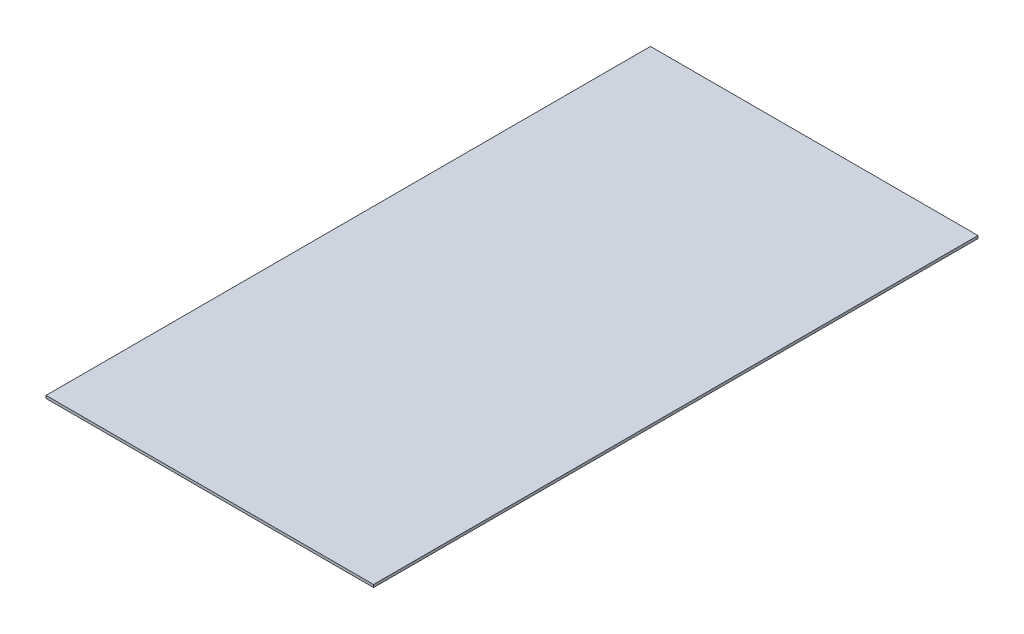
ISO-10303-21;
HEADER;
FILE_DESCRIPTION(('STEP AP214'),'2;1');
FILE_NAME('part.step','',(''),(''),'','','');
FILE_SCHEMA(('AUTOMOTIVE_DESIGN { 1 0 10303 214 1 1 1 1 }'));
ENDSEC;
DATA;
#1=APPLICATION_CONTEXT('core data for automotive mechanical design processes');
#2=APPLICATION_PROTOCOL_DEFINITION('international standard','automotive_design',2000,#1);
#3=PRODUCT_CONTEXT('',#1,'mechanical');
#4=PRODUCT('Part','Part','',(#3));
#5=PRODUCT_RELATED_PRODUCT_CATEGORY('part','',(#4));
#6=PRODUCT_DEFINITION_FORMATION('','',#4);
#7=PRODUCT_DEFINITION_CONTEXT('part definition',#1,'design');
#8=PRODUCT_DEFINITION('design','',#6,#7);
#9=PRODUCT_DEFINITION_SHAPE('','',#8);
#10=(LENGTH_UNIT() NAMED_UNIT(*) SI_UNIT(.MILLI.,.METRE.));
#11=(NAMED_UNIT(*) PLANE_ANGLE_UNIT() SI_UNIT($,.RADIAN.));
#12=(NAMED_UNIT(*) SI_UNIT($,.STERADIAN.) SOLID_ANGLE_UNIT());
#13=UNCERTAINTY_MEASURE_WITH_UNIT(LENGTH_MEASURE(1.E-05),#10,'distance_accuracy_value','');
#14=(GEOMETRIC_REPRESENTATION_CONTEXT(3) GLOBAL_UNCERTAINTY_ASSIGNED_CONTEXT((#13)) GLOBAL_UNIT_ASSIGNED_CONTEXT((#10,
#11,#12)) REPRESENTATION_CONTEXT('',''));
#15=CARTESIAN_POINT('',(0.,0.,0.));
#16=DIRECTION('',(0.,0.,1.));
#17=DIRECTION('',(1.,0.,0.));
#18=AXIS2_PLACEMENT_3D('',#15,#16,#17);
#19=CARTESIAN_POINT('',(0.,0.18,0.));
#20=DIRECTION('',(1.,0.,0.));
#21=DIRECTION('',(0.,0.,-1.));
#22=AXIS2_PLACEMENT_3D('',#19,#20,#21);
#23=PLANE('',#22);
#24=DIRECTION('',(0.,0.,1.));
#25=VECTOR('',#24,1.);
#26=CARTESIAN_POINT('',(0.,0.,0.));
#27=LINE('',#26,#25);
#28=CARTESIAN_POINT('',(0.,0.,-40.6));
#29=VERTEX_POINT('',#28);
#30=CARTESIAN_POINT('',(0.,0.,0.));
#31=VERTEX_POINT('',#30);
#32=EDGE_CURVE('E95',#29,#31,#27,.T.);
#33=ORIENTED_EDGE('',*,*,#32,.T.);
#34=DIRECTION('',(0.,-1.,0.));
#35=VECTOR('',#34,1.);
#36=CARTESIAN_POINT('',(0.,0.18,0.));
#37=LINE('',#36,#35);
#38=CARTESIAN_POINT('',(0.,0.18,0.));
#39=VERTEX_POINT('',#38);
#40=EDGE_CURVE('E11',#39,#31,#37,.T.);
#41=ORIENTED_EDGE('',*,*,#40,.F.);
#42=DIRECTION('',(0.,0.,1.));
#43=VECTOR('',#42,1.);
#44=CARTESIAN_POINT('',(0.,0.18,0.));
#45=LINE('',#44,#43);
#46=CARTESIAN_POINT('',(0.,0.18,-40.6));
#47=VERTEX_POINT('',#46);
#48=EDGE_CURVE('E83',#47,#39,#45,.T.);
#49=ORIENTED_EDGE('',*,*,#48,.F.);
#50=DIRECTION('',(0.,-1.,0.));
#51=VECTOR('',#50,1.);
#52=CARTESIAN_POINT('',(0.,0.18,-40.6));
#53=LINE('',#52,#51);
#54=EDGE_CURVE('E91',#47,#29,#53,.T.);
#55=ORIENTED_EDGE('',*,*,#54,.T.);
#56=EDGE_LOOP('',(#33,#41,#49,#55));
#57=FACE_BOUND('',#56,.T.);
#58=ADVANCED_FACE('F32',(#57),#23,.F.);
#59=CARTESIAN_POINT('',(0.,0.18,0.));
#60=DIRECTION('',(0.,0.,-1.));
#61=DIRECTION('',(-1.,0.,0.));
#62=AXIS2_PLACEMENT_3D('',#59,#60,#61);
#63=PLANE('',#62);
#64=DIRECTION('',(1.,0.,0.));
#65=VECTOR('',#64,1.);
#66=CARTESIAN_POINT('',(0.,0.,0.));
#67=LINE('',#66,#65);
#68=CARTESIAN_POINT('',(22.,0.,0.));
#69=VERTEX_POINT('',#68);
#70=EDGE_CURVE('E87',#31,#69,#67,.T.);
#71=ORIENTED_EDGE('',*,*,#70,.T.);
#72=DIRECTION('',(0.,-1.,0.));
#73=VECTOR('',#72,1.);
#74=CARTESIAN_POINT('',(22.,0.18,0.));
#75=LINE('',#74,#73);
#76=CARTESIAN_POINT('',(22.,0.18,0.));
#77=VERTEX_POINT('',#76);
#78=EDGE_CURVE('E40',#77,#69,#75,.T.);
#79=ORIENTED_EDGE('',*,*,#78,.F.);
#80=DIRECTION('',(1.,0.,0.));
#81=VECTOR('',#80,1.);
#82=CARTESIAN_POINT('',(0.,0.18,0.));
#83=LINE('',#82,#81);
#84=EDGE_CURVE('E78',#39,#77,#83,.T.);
#85=ORIENTED_EDGE('',*,*,#84,.F.);
#86=ORIENTED_EDGE('',*,*,#40,.T.);
#87=EDGE_LOOP('',(#71,#79,#85,#86));
#88=FACE_BOUND('',#87,.T.);
#89=ADVANCED_FACE('F86',(#88),#63,.F.);
#90=CARTESIAN_POINT('',(22.,0.18,0.));
#91=DIRECTION('',(-1.,0.,0.));
#92=DIRECTION('',(0.,0.,1.));
#93=AXIS2_PLACEMENT_3D('',#90,#91,#92);
#94=PLANE('',#93);
#95=DIRECTION('',(0.,0.,-1.));
#96=VECTOR('',#95,1.);
#97=CARTESIAN_POINT('',(22.,0.,0.));
#98=LINE('',#97,#96);
#99=CARTESIAN_POINT('',(22.,0.,-40.6));
#100=VERTEX_POINT('',#99);
#101=EDGE_CURVE('E65',#69,#100,#98,.T.);
#102=ORIENTED_EDGE('',*,*,#101,.T.);
#103=DIRECTION('',(0.,-1.,0.));
#104=VECTOR('',#103,1.);
#105=CARTESIAN_POINT('',(22.,0.18,-40.6));
#106=LINE('',#105,#104);
#107=CARTESIAN_POINT('',(22.,0.18,-40.6));
#108=VERTEX_POINT('',#107);
#109=EDGE_CURVE('E88',#108,#100,#106,.T.);
#110=ORIENTED_EDGE('',*,*,#109,.F.);
#111=DIRECTION('',(0.,0.,-1.));
#112=VECTOR('',#111,1.);
#113=CARTESIAN_POINT('',(22.,0.18,0.));
#114=LINE('',#113,#112);
#115=EDGE_CURVE('E81',#77,#108,#114,.T.);
#116=ORIENTED_EDGE('',*,*,#115,.F.);
#117=ORIENTED_EDGE('',*,*,#78,.T.);
#118=EDGE_LOOP('',(#102,#110,#116,#117));
#119=FACE_BOUND('',#118,.T.);
#120=ADVANCED_FACE('F89',(#119),#94,.F.);
#121=CARTESIAN_POINT('',(0.,0.18,-40.6));
#122=DIRECTION('',(0.,0.,1.));
#123=DIRECTION('',(1.,0.,0.));
#124=AXIS2_PLACEMENT_3D('',#121,#122,#123);
#125=PLANE('',#124);
#126=DIRECTION('',(-1.,0.,0.));
#127=VECTOR('',#126,1.);
#128=CARTESIAN_POINT('',(0.,0.,-40.6));
#129=LINE('',#128,#127);
#130=EDGE_CURVE('E71',#100,#29,#129,.T.);
#131=ORIENTED_EDGE('',*,*,#130,.T.);
#132=ORIENTED_EDGE('',*,*,#54,.F.);
#133=DIRECTION('',(-1.,0.,0.));
#134=VECTOR('',#133,1.);
#135=CARTESIAN_POINT('',(0.,0.18,-40.6));
#136=LINE('',#135,#134);
#137=EDGE_CURVE('E48',#108,#47,#136,.T.);
#138=ORIENTED_EDGE('',*,*,#137,.F.);
#139=ORIENTED_EDGE('',*,*,#109,.T.);
#140=EDGE_LOOP('',(#131,#132,#138,#139));
#141=FACE_BOUND('',#140,.T.);
#142=ADVANCED_FACE('F102',(#141),#125,.F.);
#143=CARTESIAN_POINT('',(0.,0.18,0.));
#144=DIRECTION('',(0.,-1.,0.));
#145=DIRECTION('',(0.,0.,-1.));
#146=AXIS2_PLACEMENT_3D('',#143,#144,#145);
#147=PLANE('',#146);
#148=ORIENTED_EDGE('',*,*,#48,.T.);
#149=ORIENTED_EDGE('',*,*,#84,.T.);
#150=ORIENTED_EDGE('',*,*,#115,.T.);
#151=ORIENTED_EDGE('',*,*,#137,.T.);
#152=EDGE_LOOP('',(#148,#149,#150,#151));
#153=FACE_BOUND('',#152,.T.);
#154=ADVANCED_FACE('F79',(#153),#147,.F.);
#155=CARTESIAN_POINT('',(0.,0.,0.));
#156=DIRECTION('',(0.,-1.,0.));
#157=DIRECTION('',(0.,0.,-1.));
#158=AXIS2_PLACEMENT_3D('',#155,#156,#157);
#159=PLANE('',#158);
#160=ORIENTED_EDGE('',*,*,#32,.F.);
#161=ORIENTED_EDGE('',*,*,#130,.F.);
#162=ORIENTED_EDGE('',*,*,#101,.F.);
#163=ORIENTED_EDGE('',*,*,#70,.F.);
#164=EDGE_LOOP('',(#160,#161,#162,#163));
#165=FACE_BOUND('',#164,.T.);
#166=ADVANCED_FACE('F105',(#165),#159,.T.);
#167=CLOSED_SHELL('',(#58,#89,#120,#142,#154,#166));
#168=MANIFOLD_SOLID_BREP('B2',#167);
#169=ADVANCED_BREP_SHAPE_REPRESENTATION('',(#18,#168),#14);
#170=SHAPE_DEFINITION_REPRESENTATION(#9,#169);
ENDSEC;
END-ISO-10303-21;
